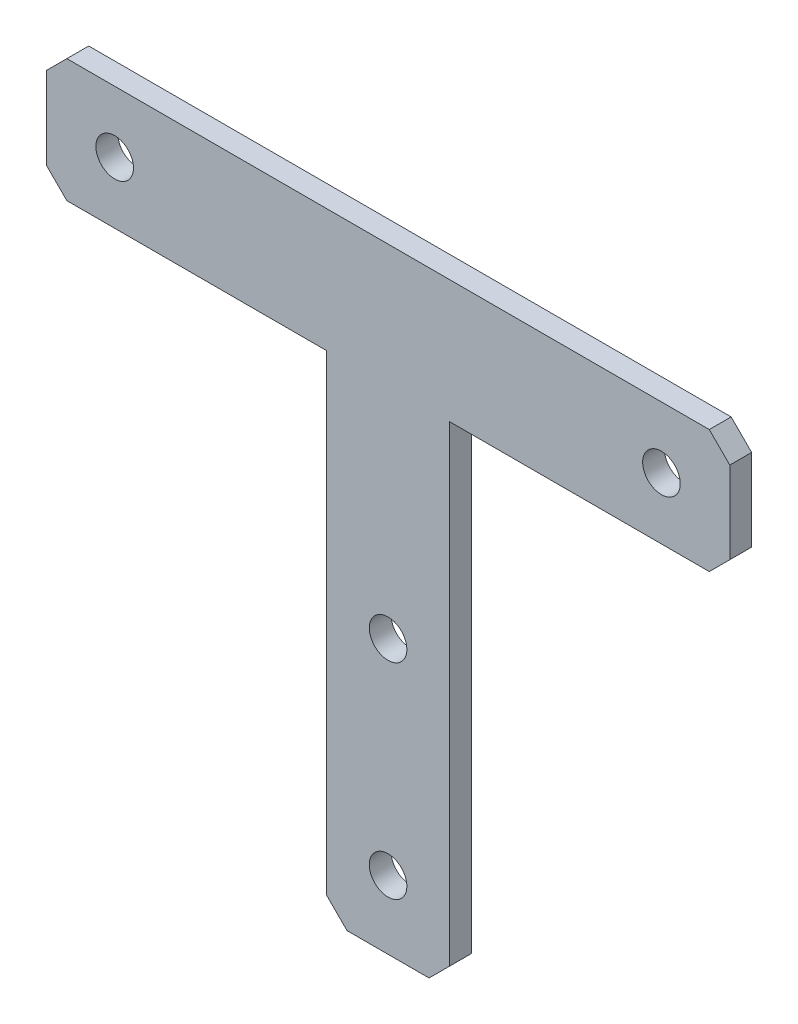
ISO-10303-21;
HEADER;
FILE_DESCRIPTION(('STEP AP214'),'2;1');
FILE_NAME('part.step','',(''),(''),'','','');
FILE_SCHEMA(('AUTOMOTIVE_DESIGN { 1 0 10303 214 1 1 1 1 }'));
ENDSEC;
DATA;
#1=APPLICATION_CONTEXT('core data for automotive mechanical design processes');
#2=APPLICATION_PROTOCOL_DEFINITION('international standard','automotive_design',2000,#1);
#3=PRODUCT_CONTEXT('',#1,'mechanical');
#4=PRODUCT('Part','Part','',(#3));
#5=PRODUCT_RELATED_PRODUCT_CATEGORY('part','',(#4));
#6=PRODUCT_DEFINITION_FORMATION('','',#4);
#7=PRODUCT_DEFINITION_CONTEXT('part definition',#1,'design');
#8=PRODUCT_DEFINITION('design','',#6,#7);
#9=PRODUCT_DEFINITION_SHAPE('','',#8);
#10=(LENGTH_UNIT() NAMED_UNIT(*) SI_UNIT(.MILLI.,.METRE.));
#11=(NAMED_UNIT(*) PLANE_ANGLE_UNIT() SI_UNIT($,.RADIAN.));
#12=(NAMED_UNIT(*) SI_UNIT($,.STERADIAN.) SOLID_ANGLE_UNIT());
#13=UNCERTAINTY_MEASURE_WITH_UNIT(LENGTH_MEASURE(1.E-05),#10,'distance_accuracy_value','');
#14=(GEOMETRIC_REPRESENTATION_CONTEXT(3) GLOBAL_UNCERTAINTY_ASSIGNED_CONTEXT((#13)) GLOBAL_UNIT_ASSIGNED_CONTEXT((#10,
#11,#12)) REPRESENTATION_CONTEXT('',''));
#15=CARTESIAN_POINT('',(0.,0.,0.));
#16=DIRECTION('',(0.,0.,1.));
#17=DIRECTION('',(1.,0.,0.));
#18=AXIS2_PLACEMENT_3D('',#15,#16,#17);
#19=CARTESIAN_POINT('',(-50.,87.,-3.2));
#20=DIRECTION('',(-1.,0.,0.));
#21=DIRECTION('',(0.,0.,1.));
#22=AXIS2_PLACEMENT_3D('',#19,#20,#21);
#23=PLANE('',#22);
#24=DIRECTION('',(0.,-1.,0.));
#25=VECTOR('',#24,1.);
#26=CARTESIAN_POINT('',(-50.,87.,0.));
#27=LINE('',#26,#25);
#28=CARTESIAN_POINT('',(-50.,87.,0.));
#29=VERTEX_POINT('',#28);
#30=CARTESIAN_POINT('',(-50.,75.,0.));
#31=VERTEX_POINT('',#30);
#32=EDGE_CURVE('E166',#29,#31,#27,.T.);
#33=ORIENTED_EDGE('',*,*,#32,.F.);
#34=DIRECTION('',(0.,0.,1.));
#35=VECTOR('',#34,1.);
#36=CARTESIAN_POINT('',(-50.,87.,-3.2));
#37=LINE('',#36,#35);
#38=CARTESIAN_POINT('',(-50.,87.,-3.2));
#39=VERTEX_POINT('',#38);
#40=EDGE_CURVE('E11',#39,#29,#37,.T.);
#41=ORIENTED_EDGE('',*,*,#40,.F.);
#42=DIRECTION('',(0.,-1.,0.));
#43=VECTOR('',#42,1.);
#44=CARTESIAN_POINT('',(-50.,87.,-3.2));
#45=LINE('',#44,#43);
#46=CARTESIAN_POINT('',(-50.,75.,-3.2));
#47=VERTEX_POINT('',#46);
#48=EDGE_CURVE('E205',#39,#47,#45,.T.);
#49=ORIENTED_EDGE('',*,*,#48,.T.);
#50=DIRECTION('',(0.,0.,1.));
#51=VECTOR('',#50,1.);
#52=CARTESIAN_POINT('',(-50.,75.,-3.2));
#53=LINE('',#52,#51);
#54=EDGE_CURVE('E36',#47,#31,#53,.T.);
#55=ORIENTED_EDGE('',*,*,#54,.T.);
#56=EDGE_LOOP('',(#33,#41,#49,#55));
#57=FACE_BOUND('',#56,.T.);
#58=ADVANCED_FACE('F33',(#57),#23,.T.);
#59=CARTESIAN_POINT('',(-47.,90.,-3.2));
#60=DIRECTION('',(-0.707106781186548,0.707106781186548,0.));
#61=DIRECTION('',(-0.707106781186548,-0.707106781186548,0.));
#62=AXIS2_PLACEMENT_3D('',#59,#60,#61);
#63=PLANE('',#62);
#64=DIRECTION('',(-0.707106781186547,-0.707106781186547,0.));
#65=VECTOR('',#64,1.);
#66=CARTESIAN_POINT('',(-47.,90.,0.));
#67=LINE('',#66,#65);
#68=CARTESIAN_POINT('',(-47.,90.,0.));
#69=VERTEX_POINT('',#68);
#70=EDGE_CURVE('E203',#69,#29,#67,.T.);
#71=ORIENTED_EDGE('',*,*,#70,.F.);
#72=DIRECTION('',(0.,0.,1.));
#73=VECTOR('',#72,1.);
#74=CARTESIAN_POINT('',(-47.,90.,-3.2));
#75=LINE('',#74,#73);
#76=CARTESIAN_POINT('',(-47.,90.,-3.2));
#77=VERTEX_POINT('',#76);
#78=EDGE_CURVE('E42',#77,#69,#75,.T.);
#79=ORIENTED_EDGE('',*,*,#78,.F.);
#80=DIRECTION('',(-0.707106781186547,-0.707106781186547,0.));
#81=VECTOR('',#80,1.);
#82=CARTESIAN_POINT('',(-47.,90.,-3.2));
#83=LINE('',#82,#81);
#84=EDGE_CURVE('E156',#77,#39,#83,.T.);
#85=ORIENTED_EDGE('',*,*,#84,.T.);
#86=ORIENTED_EDGE('',*,*,#40,.T.);
#87=EDGE_LOOP('',(#71,#79,#85,#86));
#88=FACE_BOUND('',#87,.T.);
#89=ADVANCED_FACE('F229',(#88),#63,.T.);
#90=CARTESIAN_POINT('',(47.,90.,-3.2));
#91=DIRECTION('',(0.,1.,0.));
#92=DIRECTION('',(0.,0.,1.));
#93=AXIS2_PLACEMENT_3D('',#90,#91,#92);
#94=PLANE('',#93);
#95=DIRECTION('',(-1.,0.,0.));
#96=VECTOR('',#95,1.);
#97=CARTESIAN_POINT('',(47.,90.,0.));
#98=LINE('',#97,#96);
#99=CARTESIAN_POINT('',(47.,90.,0.));
#100=VERTEX_POINT('',#99);
#101=EDGE_CURVE('E143',#100,#69,#98,.T.);
#102=ORIENTED_EDGE('',*,*,#101,.F.);
#103=DIRECTION('',(0.,0.,1.));
#104=VECTOR('',#103,1.);
#105=CARTESIAN_POINT('',(47.,90.,-3.2));
#106=LINE('',#105,#104);
#107=CARTESIAN_POINT('',(47.,90.,-3.2));
#108=VERTEX_POINT('',#107);
#109=EDGE_CURVE('E138',#108,#100,#106,.T.);
#110=ORIENTED_EDGE('',*,*,#109,.F.);
#111=DIRECTION('',(-1.,0.,0.));
#112=VECTOR('',#111,1.);
#113=CARTESIAN_POINT('',(47.,90.,-3.2));
#114=LINE('',#113,#112);
#115=EDGE_CURVE('E141',#108,#77,#114,.T.);
#116=ORIENTED_EDGE('',*,*,#115,.T.);
#117=ORIENTED_EDGE('',*,*,#78,.T.);
#118=EDGE_LOOP('',(#102,#110,#116,#117));
#119=FACE_BOUND('',#118,.T.);
#120=ADVANCED_FACE('F140',(#119),#94,.T.);
#121=CARTESIAN_POINT('',(50.,87.,-3.2));
#122=DIRECTION('',(0.707106781186548,0.707106781186548,0.));
#123=DIRECTION('',(-0.707106781186548,0.707106781186548,0.));
#124=AXIS2_PLACEMENT_3D('',#121,#122,#123);
#125=PLANE('',#124);
#126=DIRECTION('',(-0.707106781186547,0.707106781186547,0.));
#127=VECTOR('',#126,1.);
#128=CARTESIAN_POINT('',(50.,87.,0.));
#129=LINE('',#128,#127);
#130=CARTESIAN_POINT('',(50.,87.,0.));
#131=VERTEX_POINT('',#130);
#132=EDGE_CURVE('E200',#131,#100,#129,.T.);
#133=ORIENTED_EDGE('',*,*,#132,.F.);
#134=DIRECTION('',(0.,0.,1.));
#135=VECTOR('',#134,1.);
#136=CARTESIAN_POINT('',(50.,87.,-3.2));
#137=LINE('',#136,#135);
#138=CARTESIAN_POINT('',(50.,87.,-3.2));
#139=VERTEX_POINT('',#138);
#140=EDGE_CURVE('E148',#139,#131,#137,.T.);
#141=ORIENTED_EDGE('',*,*,#140,.F.);
#142=DIRECTION('',(-0.707106781186547,0.707106781186547,0.));
#143=VECTOR('',#142,1.);
#144=CARTESIAN_POINT('',(50.,87.,-3.2));
#145=LINE('',#144,#143);
#146=EDGE_CURVE('E154',#139,#108,#145,.T.);
#147=ORIENTED_EDGE('',*,*,#146,.T.);
#148=ORIENTED_EDGE('',*,*,#109,.T.);
#149=EDGE_LOOP('',(#133,#141,#147,#148));
#150=FACE_BOUND('',#149,.T.);
#151=ADVANCED_FACE('F158',(#150),#125,.T.);
#152=CARTESIAN_POINT('',(50.,75.,-3.2));
#153=DIRECTION('',(1.,0.,0.));
#154=DIRECTION('',(0.,0.,-1.));
#155=AXIS2_PLACEMENT_3D('',#152,#153,#154);
#156=PLANE('',#155);
#157=DIRECTION('',(0.,1.,0.));
#158=VECTOR('',#157,1.);
#159=CARTESIAN_POINT('',(50.,75.,0.));
#160=LINE('',#159,#158);
#161=CARTESIAN_POINT('',(50.,75.,0.));
#162=VERTEX_POINT('',#161);
#163=EDGE_CURVE('E197',#162,#131,#160,.T.);
#164=ORIENTED_EDGE('',*,*,#163,.F.);
#165=DIRECTION('',(0.,0.,1.));
#166=VECTOR('',#165,1.);
#167=CARTESIAN_POINT('',(50.,75.,-3.2));
#168=LINE('',#167,#166);
#169=CARTESIAN_POINT('',(50.,75.,-3.2));
#170=VERTEX_POINT('',#169);
#171=EDGE_CURVE('E209',#170,#162,#168,.T.);
#172=ORIENTED_EDGE('',*,*,#171,.F.);
#173=DIRECTION('',(0.,1.,0.));
#174=VECTOR('',#173,1.);
#175=CARTESIAN_POINT('',(50.,75.,-3.2));
#176=LINE('',#175,#174);
#177=EDGE_CURVE('E159',#170,#139,#176,.T.);
#178=ORIENTED_EDGE('',*,*,#177,.T.);
#179=ORIENTED_EDGE('',*,*,#140,.T.);
#180=EDGE_LOOP('',(#164,#172,#178,#179));
#181=FACE_BOUND('',#180,.T.);
#182=ADVANCED_FACE('F242',(#181),#156,.T.);
#183=CARTESIAN_POINT('',(47.,72.,-3.2));
#184=DIRECTION('',(0.707106781186548,-0.707106781186548,0.));
#185=DIRECTION('',(0.707106781186548,0.707106781186548,0.));
#186=AXIS2_PLACEMENT_3D('',#183,#184,#185);
#187=PLANE('',#186);
#188=DIRECTION('',(0.707106781186547,0.707106781186547,0.));
#189=VECTOR('',#188,1.);
#190=CARTESIAN_POINT('',(47.,72.,0.));
#191=LINE('',#190,#189);
#192=CARTESIAN_POINT('',(47.,72.,0.));
#193=VERTEX_POINT('',#192);
#194=EDGE_CURVE('E194',#193,#162,#191,.T.);
#195=ORIENTED_EDGE('',*,*,#194,.F.);
#196=DIRECTION('',(0.,0.,1.));
#197=VECTOR('',#196,1.);
#198=CARTESIAN_POINT('',(47.,72.,-3.2));
#199=LINE('',#198,#197);
#200=CARTESIAN_POINT('',(47.,72.,-3.2));
#201=VERTEX_POINT('',#200);
#202=EDGE_CURVE('E211',#201,#193,#199,.T.);
#203=ORIENTED_EDGE('',*,*,#202,.F.);
#204=DIRECTION('',(0.707106781186547,0.707106781186547,0.));
#205=VECTOR('',#204,1.);
#206=CARTESIAN_POINT('',(47.,72.,-3.2));
#207=LINE('',#206,#205);
#208=EDGE_CURVE('E161',#201,#170,#207,.T.);
#209=ORIENTED_EDGE('',*,*,#208,.T.);
#210=ORIENTED_EDGE('',*,*,#171,.T.);
#211=EDGE_LOOP('',(#195,#203,#209,#210));
#212=FACE_BOUND('',#211,.T.);
#213=ADVANCED_FACE('F245',(#212),#187,.T.);
#214=CARTESIAN_POINT('',(9.,72.,-3.2));
#215=DIRECTION('',(0.,-1.,0.));
#216=DIRECTION('',(0.,0.,-1.));
#217=AXIS2_PLACEMENT_3D('',#214,#215,#216);
#218=PLANE('',#217);
#219=DIRECTION('',(1.,0.,0.));
#220=VECTOR('',#219,1.);
#221=CARTESIAN_POINT('',(9.,72.,0.));
#222=LINE('',#221,#220);
#223=CARTESIAN_POINT('',(9.,72.,0.));
#224=VERTEX_POINT('',#223);
#225=EDGE_CURVE('E191',#224,#193,#222,.T.);
#226=ORIENTED_EDGE('',*,*,#225,.F.);
#227=DIRECTION('',(0.,0.,1.));
#228=VECTOR('',#227,1.);
#229=CARTESIAN_POINT('',(9.,72.,-3.2));
#230=LINE('',#229,#228);
#231=CARTESIAN_POINT('',(9.,72.,-3.2));
#232=VERTEX_POINT('',#231);
#233=EDGE_CURVE('E213',#232,#224,#230,.T.);
#234=ORIENTED_EDGE('',*,*,#233,.F.);
#235=DIRECTION('',(1.,0.,0.));
#236=VECTOR('',#235,1.);
#237=CARTESIAN_POINT('',(9.,72.,-3.2));
#238=LINE('',#237,#236);
#239=EDGE_CURVE('E353',#232,#201,#238,.T.);
#240=ORIENTED_EDGE('',*,*,#239,.T.);
#241=ORIENTED_EDGE('',*,*,#202,.T.);
#242=EDGE_LOOP('',(#226,#234,#240,#241));
#243=FACE_BOUND('',#242,.T.);
#244=ADVANCED_FACE('F249',(#243),#218,.T.);
#245=CARTESIAN_POINT('',(9.,3.,-3.2));
#246=DIRECTION('',(1.,0.,0.));
#247=DIRECTION('',(0.,0.,-1.));
#248=AXIS2_PLACEMENT_3D('',#245,#246,#247);
#249=PLANE('',#248);
#250=DIRECTION('',(0.,1.,0.));
#251=VECTOR('',#250,1.);
#252=CARTESIAN_POINT('',(9.,3.,0.));
#253=LINE('',#252,#251);
#254=CARTESIAN_POINT('',(9.,3.,0.));
#255=VERTEX_POINT('',#254);
#256=EDGE_CURVE('E188',#255,#224,#253,.T.);
#257=ORIENTED_EDGE('',*,*,#256,.F.);
#258=DIRECTION('',(0.,0.,1.));
#259=VECTOR('',#258,1.);
#260=CARTESIAN_POINT('',(9.,3.,-3.2));
#261=LINE('',#260,#259);
#262=CARTESIAN_POINT('',(9.,3.,-3.2));
#263=VERTEX_POINT('',#262);
#264=EDGE_CURVE('E215',#263,#255,#261,.T.);
#265=ORIENTED_EDGE('',*,*,#264,.F.);
#266=DIRECTION('',(0.,1.,0.));
#267=VECTOR('',#266,1.);
#268=CARTESIAN_POINT('',(9.,3.,-3.2));
#269=LINE('',#268,#267);
#270=EDGE_CURVE('E350',#263,#232,#269,.T.);
#271=ORIENTED_EDGE('',*,*,#270,.T.);
#272=ORIENTED_EDGE('',*,*,#233,.T.);
#273=EDGE_LOOP('',(#257,#265,#271,#272));
#274=FACE_BOUND('',#273,.T.);
#275=ADVANCED_FACE('F253',(#274),#249,.T.);
#276=CARTESIAN_POINT('',(6.,0.,-3.2));
#277=DIRECTION('',(0.707106781186548,-0.707106781186547,0.));
#278=DIRECTION('',(0.707106781186547,0.707106781186548,0.));
#279=AXIS2_PLACEMENT_3D('',#276,#277,#278);
#280=PLANE('',#279);
#281=DIRECTION('',(0.707106781186547,0.707106781186548,0.));
#282=VECTOR('',#281,1.);
#283=CARTESIAN_POINT('',(6.,0.,0.));
#284=LINE('',#283,#282);
#285=CARTESIAN_POINT('',(6.,0.,0.));
#286=VERTEX_POINT('',#285);
#287=EDGE_CURVE('E185',#286,#255,#284,.T.);
#288=ORIENTED_EDGE('',*,*,#287,.F.);
#289=DIRECTION('',(0.,0.,1.));
#290=VECTOR('',#289,1.);
#291=CARTESIAN_POINT('',(6.,0.,-3.2));
#292=LINE('',#291,#290);
#293=CARTESIAN_POINT('',(6.,0.,-3.2));
#294=VERTEX_POINT('',#293);
#295=EDGE_CURVE('E217',#294,#286,#292,.T.);
#296=ORIENTED_EDGE('',*,*,#295,.F.);
#297=DIRECTION('',(0.707106781186547,0.707106781186548,0.));
#298=VECTOR('',#297,1.);
#299=CARTESIAN_POINT('',(6.,0.,-3.2));
#300=LINE('',#299,#298);
#301=EDGE_CURVE('E347',#294,#263,#300,.T.);
#302=ORIENTED_EDGE('',*,*,#301,.T.);
#303=ORIENTED_EDGE('',*,*,#264,.T.);
#304=EDGE_LOOP('',(#288,#296,#302,#303));
#305=FACE_BOUND('',#304,.T.);
#306=ADVANCED_FACE('F257',(#305),#280,.T.);
#307=CARTESIAN_POINT('',(-6.,0.,-3.2));
#308=DIRECTION('',(0.,-1.,0.));
#309=DIRECTION('',(0.,0.,-1.));
#310=AXIS2_PLACEMENT_3D('',#307,#308,#309);
#311=PLANE('',#310);
#312=DIRECTION('',(1.,0.,0.));
#313=VECTOR('',#312,1.);
#314=CARTESIAN_POINT('',(-6.,0.,0.));
#315=LINE('',#314,#313);
#316=CARTESIAN_POINT('',(-6.,0.,0.));
#317=VERTEX_POINT('',#316);
#318=EDGE_CURVE('E182',#317,#286,#315,.T.);
#319=ORIENTED_EDGE('',*,*,#318,.F.);
#320=DIRECTION('',(0.,0.,1.));
#321=VECTOR('',#320,1.);
#322=CARTESIAN_POINT('',(-6.,0.,-3.2));
#323=LINE('',#322,#321);
#324=CARTESIAN_POINT('',(-6.,0.,-3.2));
#325=VERTEX_POINT('',#324);
#326=EDGE_CURVE('E219',#325,#317,#323,.T.);
#327=ORIENTED_EDGE('',*,*,#326,.F.);
#328=DIRECTION('',(1.,0.,0.));
#329=VECTOR('',#328,1.);
#330=CARTESIAN_POINT('',(-6.,0.,-3.2));
#331=LINE('',#330,#329);
#332=EDGE_CURVE('E344',#325,#294,#331,.T.);
#333=ORIENTED_EDGE('',*,*,#332,.T.);
#334=ORIENTED_EDGE('',*,*,#295,.T.);
#335=EDGE_LOOP('',(#319,#327,#333,#334));
#336=FACE_BOUND('',#335,.T.);
#337=ADVANCED_FACE('F261',(#336),#311,.T.);
#338=CARTESIAN_POINT('',(-9.,3.,-3.2));
#339=DIRECTION('',(-0.707106781186548,-0.707106781186547,0.));
#340=DIRECTION('',(0.707106781186547,-0.707106781186548,0.));
#341=AXIS2_PLACEMENT_3D('',#338,#339,#340);
#342=PLANE('',#341);
#343=DIRECTION('',(0.707106781186547,-0.707106781186548,0.));
#344=VECTOR('',#343,1.);
#345=CARTESIAN_POINT('',(-9.,3.,0.));
#346=LINE('',#345,#344);
#347=CARTESIAN_POINT('',(-9.,3.,0.));
#348=VERTEX_POINT('',#347);
#349=EDGE_CURVE('E179',#348,#317,#346,.T.);
#350=ORIENTED_EDGE('',*,*,#349,.F.);
#351=DIRECTION('',(0.,0.,1.));
#352=VECTOR('',#351,1.);
#353=CARTESIAN_POINT('',(-9.,3.,-3.2));
#354=LINE('',#353,#352);
#355=CARTESIAN_POINT('',(-9.,3.,-3.2));
#356=VERTEX_POINT('',#355);
#357=EDGE_CURVE('E221',#356,#348,#354,.T.);
#358=ORIENTED_EDGE('',*,*,#357,.F.);
#359=DIRECTION('',(0.707106781186547,-0.707106781186548,0.));
#360=VECTOR('',#359,1.);
#361=CARTESIAN_POINT('',(-9.,3.,-3.2));
#362=LINE('',#361,#360);
#363=EDGE_CURVE('E341',#356,#325,#362,.T.);
#364=ORIENTED_EDGE('',*,*,#363,.T.);
#365=ORIENTED_EDGE('',*,*,#326,.T.);
#366=EDGE_LOOP('',(#350,#358,#364,#365));
#367=FACE_BOUND('',#366,.T.);
#368=ADVANCED_FACE('F265',(#367),#342,.T.);
#369=CARTESIAN_POINT('',(-9.,72.,-3.2));
#370=DIRECTION('',(-1.,0.,0.));
#371=DIRECTION('',(0.,0.,1.));
#372=AXIS2_PLACEMENT_3D('',#369,#370,#371);
#373=PLANE('',#372);
#374=DIRECTION('',(0.,-1.,0.));
#375=VECTOR('',#374,1.);
#376=CARTESIAN_POINT('',(-9.,72.,0.));
#377=LINE('',#376,#375);
#378=CARTESIAN_POINT('',(-9.,72.,0.));
#379=VERTEX_POINT('',#378);
#380=EDGE_CURVE('E176',#379,#348,#377,.T.);
#381=ORIENTED_EDGE('',*,*,#380,.F.);
#382=DIRECTION('',(0.,0.,1.));
#383=VECTOR('',#382,1.);
#384=CARTESIAN_POINT('',(-9.,72.,-3.2));
#385=LINE('',#384,#383);
#386=CARTESIAN_POINT('',(-9.,72.,-3.2));
#387=VERTEX_POINT('',#386);
#388=EDGE_CURVE('E223',#387,#379,#385,.T.);
#389=ORIENTED_EDGE('',*,*,#388,.F.);
#390=DIRECTION('',(0.,-1.,0.));
#391=VECTOR('',#390,1.);
#392=CARTESIAN_POINT('',(-9.,72.,-3.2));
#393=LINE('',#392,#391);
#394=EDGE_CURVE('E338',#387,#356,#393,.T.);
#395=ORIENTED_EDGE('',*,*,#394,.T.);
#396=ORIENTED_EDGE('',*,*,#357,.T.);
#397=EDGE_LOOP('',(#381,#389,#395,#396));
#398=FACE_BOUND('',#397,.T.);
#399=ADVANCED_FACE('F269',(#398),#373,.T.);
#400=CARTESIAN_POINT('',(-47.,72.,-3.2));
#401=DIRECTION('',(0.,-1.,0.));
#402=DIRECTION('',(0.,0.,-1.));
#403=AXIS2_PLACEMENT_3D('',#400,#401,#402);
#404=PLANE('',#403);
#405=DIRECTION('',(1.,0.,0.));
#406=VECTOR('',#405,1.);
#407=CARTESIAN_POINT('',(-47.,72.,0.));
#408=LINE('',#407,#406);
#409=CARTESIAN_POINT('',(-47.,72.,0.));
#410=VERTEX_POINT('',#409);
#411=EDGE_CURVE('E173',#410,#379,#408,.T.);
#412=ORIENTED_EDGE('',*,*,#411,.F.);
#413=DIRECTION('',(0.,0.,1.));
#414=VECTOR('',#413,1.);
#415=CARTESIAN_POINT('',(-47.,72.,-3.2));
#416=LINE('',#415,#414);
#417=CARTESIAN_POINT('',(-47.,72.,-3.2));
#418=VERTEX_POINT('',#417);
#419=EDGE_CURVE('E224',#418,#410,#416,.T.);
#420=ORIENTED_EDGE('',*,*,#419,.F.);
#421=DIRECTION('',(1.,0.,0.));
#422=VECTOR('',#421,1.);
#423=CARTESIAN_POINT('',(-47.,72.,-3.2));
#424=LINE('',#423,#422);
#425=EDGE_CURVE('E335',#418,#387,#424,.T.);
#426=ORIENTED_EDGE('',*,*,#425,.T.);
#427=ORIENTED_EDGE('',*,*,#388,.T.);
#428=EDGE_LOOP('',(#412,#420,#426,#427));
#429=FACE_BOUND('',#428,.T.);
#430=ADVANCED_FACE('F273',(#429),#404,.T.);
#431=CARTESIAN_POINT('',(-50.,75.,-3.2));
#432=DIRECTION('',(-0.707106781186548,-0.707106781186548,0.));
#433=DIRECTION('',(0.707106781186548,-0.707106781186548,0.));
#434=AXIS2_PLACEMENT_3D('',#431,#432,#433);
#435=PLANE('',#434);
#436=DIRECTION('',(0.707106781186547,-0.707106781186547,0.));
#437=VECTOR('',#436,1.);
#438=CARTESIAN_POINT('',(-50.,75.,0.));
#439=LINE('',#438,#437);
#440=EDGE_CURVE('E169',#31,#410,#439,.T.);
#441=ORIENTED_EDGE('',*,*,#440,.F.);
#442=ORIENTED_EDGE('',*,*,#54,.F.);
#443=DIRECTION('',(0.707106781186547,-0.707106781186547,0.));
#444=VECTOR('',#443,1.);
#445=CARTESIAN_POINT('',(-50.,75.,-3.2));
#446=LINE('',#445,#444);
#447=EDGE_CURVE('E333',#47,#418,#446,.T.);
#448=ORIENTED_EDGE('',*,*,#447,.T.);
#449=ORIENTED_EDGE('',*,*,#419,.T.);
#450=EDGE_LOOP('',(#441,#442,#448,#449));
#451=FACE_BOUND('',#450,.T.);
#452=ADVANCED_FACE('F226',(#451),#435,.T.);
#453=CARTESIAN_POINT('',(0.,0.,-3.2));
#454=DIRECTION('',(0.,0.,1.));
#455=DIRECTION('',(1.,0.,0.));
#456=AXIS2_PLACEMENT_3D('',#453,#454,#455);
#457=PLANE('',#456);
#458=CARTESIAN_POINT('',(-40.,81.,-3.2));
#459=DIRECTION('',(0.,0.,1.));
#460=DIRECTION('',(1.,0.,0.));
#461=AXIS2_PLACEMENT_3D('',#458,#459,#460);
#462=CIRCLE('',#461,2.75);
#463=CARTESIAN_POINT('',(-37.25,81.,-3.2));
#464=VERTEX_POINT('',#463);
#465=EDGE_CURVE('E308',#464,#464,#462,.T.);
#466=ORIENTED_EDGE('',*,*,#465,.T.);
#467=EDGE_LOOP('',(#466));
#468=FACE_BOUND('',#467,.T.);
#469=CARTESIAN_POINT('',(0.,10.,-3.2));
#470=DIRECTION('',(0.,0.,1.));
#471=DIRECTION('',(1.,0.,0.));
#472=AXIS2_PLACEMENT_3D('',#469,#470,#471);
#473=CIRCLE('',#472,2.75);
#474=CARTESIAN_POINT('',(2.75,10.,-3.2));
#475=VERTEX_POINT('',#474);
#476=EDGE_CURVE('E316',#475,#475,#473,.T.);
#477=ORIENTED_EDGE('',*,*,#476,.T.);
#478=EDGE_LOOP('',(#477));
#479=FACE_BOUND('',#478,.T.);
#480=CARTESIAN_POINT('',(0.,40.,-3.2));
#481=DIRECTION('',(0.,0.,1.));
#482=DIRECTION('',(1.,0.,0.));
#483=AXIS2_PLACEMENT_3D('',#480,#481,#482);
#484=CIRCLE('',#483,2.75);
#485=CARTESIAN_POINT('',(2.75,40.,-3.2));
#486=VERTEX_POINT('',#485);
#487=EDGE_CURVE('E322',#486,#486,#484,.T.);
#488=ORIENTED_EDGE('',*,*,#487,.T.);
#489=EDGE_LOOP('',(#488));
#490=FACE_BOUND('',#489,.T.);
#491=CARTESIAN_POINT('',(40.,81.,-3.2));
#492=DIRECTION('',(0.,0.,1.));
#493=DIRECTION('',(1.,0.,0.));
#494=AXIS2_PLACEMENT_3D('',#491,#492,#493);
#495=CIRCLE('',#494,2.75);
#496=CARTESIAN_POINT('',(42.75,81.,-3.2));
#497=VERTEX_POINT('',#496);
#498=EDGE_CURVE('E170',#497,#497,#495,.T.);
#499=ORIENTED_EDGE('',*,*,#498,.T.);
#500=EDGE_LOOP('',(#499));
#501=FACE_BOUND('',#500,.T.);
#502=ORIENTED_EDGE('',*,*,#48,.F.);
#503=ORIENTED_EDGE('',*,*,#84,.F.);
#504=ORIENTED_EDGE('',*,*,#115,.F.);
#505=ORIENTED_EDGE('',*,*,#146,.F.);
#506=ORIENTED_EDGE('',*,*,#177,.F.);
#507=ORIENTED_EDGE('',*,*,#208,.F.);
#508=ORIENTED_EDGE('',*,*,#239,.F.);
#509=ORIENTED_EDGE('',*,*,#270,.F.);
#510=ORIENTED_EDGE('',*,*,#301,.F.);
#511=ORIENTED_EDGE('',*,*,#332,.F.);
#512=ORIENTED_EDGE('',*,*,#363,.F.);
#513=ORIENTED_EDGE('',*,*,#394,.F.);
#514=ORIENTED_EDGE('',*,*,#425,.F.);
#515=ORIENTED_EDGE('',*,*,#447,.F.);
#516=EDGE_LOOP('',(#502,#503,#504,#505,#506,#507,#508,#509,#510,#511,#512,#513,#514,#515));
#517=FACE_BOUND('',#516,.T.);
#518=ADVANCED_FACE('F152',(#468,#479,#490,#501,#517),#457,.F.);
#519=CARTESIAN_POINT('',(0.,0.,0.));
#520=DIRECTION('',(0.,0.,1.));
#521=DIRECTION('',(1.,0.,0.));
#522=AXIS2_PLACEMENT_3D('',#519,#520,#521);
#523=PLANE('',#522);
#524=CARTESIAN_POINT('',(-40.,81.,0.));
#525=DIRECTION('',(0.,0.,1.));
#526=DIRECTION('',(1.,0.,0.));
#527=AXIS2_PLACEMENT_3D('',#524,#525,#526);
#528=CIRCLE('',#527,2.75);
#529=CARTESIAN_POINT('',(-37.25,81.,0.));
#530=VERTEX_POINT('',#529);
#531=EDGE_CURVE('E311',#530,#530,#528,.T.);
#532=ORIENTED_EDGE('',*,*,#531,.F.);
#533=EDGE_LOOP('',(#532));
#534=FACE_BOUND('',#533,.T.);
#535=CARTESIAN_POINT('',(0.,10.,0.));
#536=DIRECTION('',(0.,0.,1.));
#537=DIRECTION('',(1.,0.,0.));
#538=AXIS2_PLACEMENT_3D('',#535,#536,#537);
#539=CIRCLE('',#538,2.75);
#540=CARTESIAN_POINT('',(2.75,10.,0.));
#541=VERTEX_POINT('',#540);
#542=EDGE_CURVE('E313',#541,#541,#539,.T.);
#543=ORIENTED_EDGE('',*,*,#542,.F.);
#544=EDGE_LOOP('',(#543));
#545=FACE_BOUND('',#544,.T.);
#546=CARTESIAN_POINT('',(0.,40.,0.));
#547=DIRECTION('',(0.,0.,1.));
#548=DIRECTION('',(1.,0.,0.));
#549=AXIS2_PLACEMENT_3D('',#546,#547,#548);
#550=CIRCLE('',#549,2.75);
#551=CARTESIAN_POINT('',(2.75,40.,0.));
#552=VERTEX_POINT('',#551);
#553=EDGE_CURVE('E319',#552,#552,#550,.T.);
#554=ORIENTED_EDGE('',*,*,#553,.F.);
#555=EDGE_LOOP('',(#554));
#556=FACE_BOUND('',#555,.T.);
#557=CARTESIAN_POINT('',(40.,81.,0.));
#558=DIRECTION('',(0.,0.,1.));
#559=DIRECTION('',(1.,0.,0.));
#560=AXIS2_PLACEMENT_3D('',#557,#558,#559);
#561=CIRCLE('',#560,2.75);
#562=CARTESIAN_POINT('',(42.75,81.,0.));
#563=VERTEX_POINT('',#562);
#564=EDGE_CURVE('E325',#563,#563,#561,.T.);
#565=ORIENTED_EDGE('',*,*,#564,.F.);
#566=EDGE_LOOP('',(#565));
#567=FACE_BOUND('',#566,.T.);
#568=ORIENTED_EDGE('',*,*,#32,.T.);
#569=ORIENTED_EDGE('',*,*,#440,.T.);
#570=ORIENTED_EDGE('',*,*,#411,.T.);
#571=ORIENTED_EDGE('',*,*,#380,.T.);
#572=ORIENTED_EDGE('',*,*,#349,.T.);
#573=ORIENTED_EDGE('',*,*,#318,.T.);
#574=ORIENTED_EDGE('',*,*,#287,.T.);
#575=ORIENTED_EDGE('',*,*,#256,.T.);
#576=ORIENTED_EDGE('',*,*,#225,.T.);
#577=ORIENTED_EDGE('',*,*,#194,.T.);
#578=ORIENTED_EDGE('',*,*,#163,.T.);
#579=ORIENTED_EDGE('',*,*,#132,.T.);
#580=ORIENTED_EDGE('',*,*,#101,.T.);
#581=ORIENTED_EDGE('',*,*,#70,.T.);
#582=EDGE_LOOP('',(#568,#569,#570,#571,#572,#573,#574,#575,#576,#577,#578,#579,#580,#581));
#583=FACE_BOUND('',#582,.T.);
#584=ADVANCED_FACE('F228',(#534,#545,#556,#567,#583),#523,.T.);
#585=CARTESIAN_POINT('',(40.,81.,-3.2));
#586=DIRECTION('',(0.,0.,1.));
#587=DIRECTION('',(1.,0.,0.));
#588=AXIS2_PLACEMENT_3D('',#585,#586,#587);
#589=CYLINDRICAL_SURFACE('',#588,2.75);
#590=ORIENTED_EDGE('',*,*,#498,.F.);
#591=EDGE_LOOP('',(#590));
#592=FACE_BOUND('',#591,.T.);
#593=ORIENTED_EDGE('',*,*,#564,.T.);
#594=EDGE_LOOP('',(#593));
#595=FACE_BOUND('',#594,.T.);
#596=ADVANCED_FACE('F285',(#592,#595),#589,.F.);
#597=CARTESIAN_POINT('',(0.,40.,-3.2));
#598=DIRECTION('',(0.,0.,1.));
#599=DIRECTION('',(1.,0.,0.));
#600=AXIS2_PLACEMENT_3D('',#597,#598,#599);
#601=CYLINDRICAL_SURFACE('',#600,2.75);
#602=ORIENTED_EDGE('',*,*,#487,.F.);
#603=EDGE_LOOP('',(#602));
#604=FACE_BOUND('',#603,.T.);
#605=ORIENTED_EDGE('',*,*,#553,.T.);
#606=EDGE_LOOP('',(#605));
#607=FACE_BOUND('',#606,.T.);
#608=ADVANCED_FACE('F292',(#604,#607),#601,.F.);
#609=CARTESIAN_POINT('',(0.,10.,-3.2));
#610=DIRECTION('',(0.,0.,1.));
#611=DIRECTION('',(1.,0.,0.));
#612=AXIS2_PLACEMENT_3D('',#609,#610,#611);
#613=CYLINDRICAL_SURFACE('',#612,2.75);
#614=ORIENTED_EDGE('',*,*,#476,.F.);
#615=EDGE_LOOP('',(#614));
#616=FACE_BOUND('',#615,.T.);
#617=ORIENTED_EDGE('',*,*,#542,.T.);
#618=EDGE_LOOP('',(#617));
#619=FACE_BOUND('',#618,.T.);
#620=ADVANCED_FACE('F296',(#616,#619),#613,.F.);
#621=CARTESIAN_POINT('',(-40.,81.,-3.2));
#622=DIRECTION('',(0.,0.,1.));
#623=DIRECTION('',(1.,0.,0.));
#624=AXIS2_PLACEMENT_3D('',#621,#622,#623);
#625=CYLINDRICAL_SURFACE('',#624,2.75);
#626=ORIENTED_EDGE('',*,*,#465,.F.);
#627=EDGE_LOOP('',(#626));
#628=FACE_BOUND('',#627,.T.);
#629=ORIENTED_EDGE('',*,*,#531,.T.);
#630=EDGE_LOOP('',(#629));
#631=FACE_BOUND('',#630,.T.);
#632=ADVANCED_FACE('F300',(#628,#631),#625,.F.);
#633=CLOSED_SHELL('',(#58,#89,#120,#151,#182,#213,#244,#275,#306,#337,#368,#399,#430,#452,#518,
#584,#596,#608,#620,#632));
#634=MANIFOLD_SOLID_BREP('B2',#633);
#635=ADVANCED_BREP_SHAPE_REPRESENTATION('',(#18,#634),#14);
#636=SHAPE_DEFINITION_REPRESENTATION(#9,#635);
ENDSEC;
END-ISO-10303-21;
